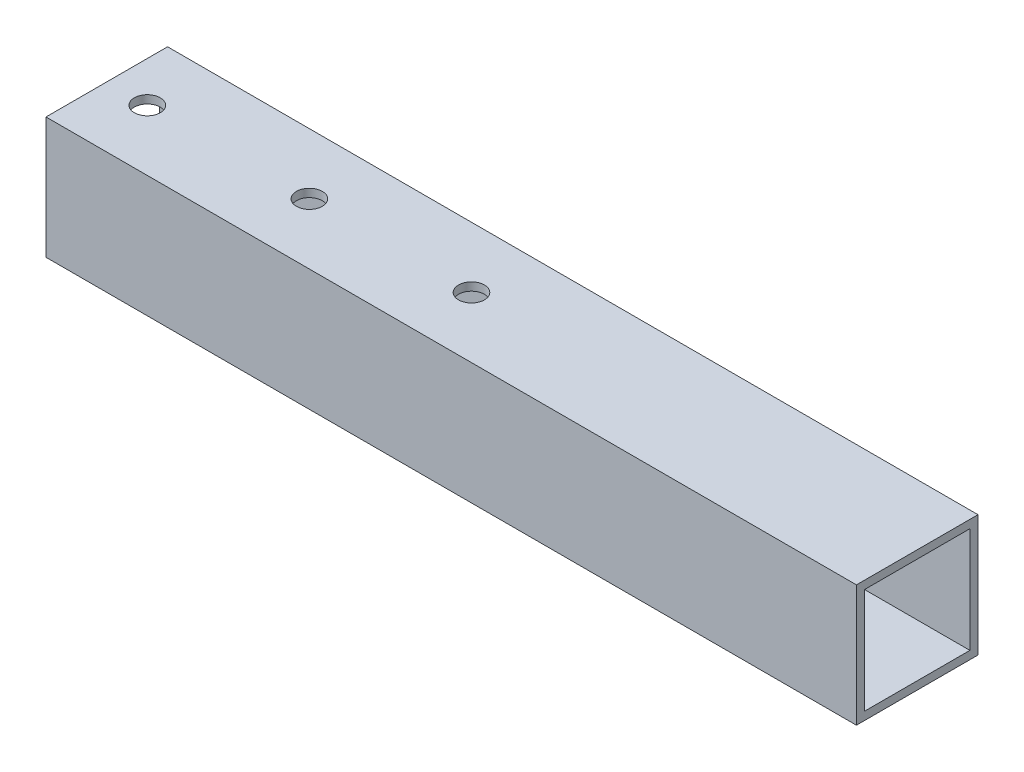
ISO-10303-21;
HEADER;
FILE_DESCRIPTION(('STEP AP214'),'2;1');
FILE_NAME('part.step','',(''),(''),'','','');
FILE_SCHEMA(('AUTOMOTIVE_DESIGN { 1 0 10303 214 1 1 1 1 }'));
ENDSEC;
DATA;
#1=APPLICATION_CONTEXT('core data for automotive mechanical design processes');
#2=APPLICATION_PROTOCOL_DEFINITION('international standard','automotive_design',2000,#1);
#3=PRODUCT_CONTEXT('',#1,'mechanical');
#4=PRODUCT('Part','Part','',(#3));
#5=PRODUCT_RELATED_PRODUCT_CATEGORY('part','',(#4));
#6=PRODUCT_DEFINITION_FORMATION('','',#4);
#7=PRODUCT_DEFINITION_CONTEXT('part definition',#1,'design');
#8=PRODUCT_DEFINITION('design','',#6,#7);
#9=PRODUCT_DEFINITION_SHAPE('','',#8);
#10=(LENGTH_UNIT() NAMED_UNIT(*) SI_UNIT(.MILLI.,.METRE.));
#11=(NAMED_UNIT(*) PLANE_ANGLE_UNIT() SI_UNIT($,.RADIAN.));
#12=(NAMED_UNIT(*) SI_UNIT($,.STERADIAN.) SOLID_ANGLE_UNIT());
#13=UNCERTAINTY_MEASURE_WITH_UNIT(LENGTH_MEASURE(1.E-05),#10,'distance_accuracy_value','');
#14=(GEOMETRIC_REPRESENTATION_CONTEXT(3) GLOBAL_UNCERTAINTY_ASSIGNED_CONTEXT((#13)) GLOBAL_UNIT_ASSIGNED_CONTEXT((#10,
#11,#12)) REPRESENTATION_CONTEXT('',''));
#15=CARTESIAN_POINT('',(0.,0.,0.));
#16=DIRECTION('',(0.,0.,1.));
#17=DIRECTION('',(1.,0.,0.));
#18=AXIS2_PLACEMENT_3D('',#15,#16,#17);
#19=CARTESIAN_POINT('',(100.,-6.50000000000001,-6.49999999999999));
#20=DIRECTION('',(0.,0.,1.));
#21=DIRECTION('',(1.,0.,0.));
#22=AXIS2_PLACEMENT_3D('',#19,#20,#21);
#23=PLANE('',#22);
#24=DIRECTION('',(0.,1.,0.));
#25=VECTOR('',#24,1.);
#26=CARTESIAN_POINT('',(0.,-6.50000000000001,-6.49999999999999));
#27=LINE('',#26,#25);
#28=CARTESIAN_POINT('',(0.,-6.50000000000001,-6.49999999999999));
#29=VERTEX_POINT('',#28);
#30=CARTESIAN_POINT('',(0.,6.49999999999999,-6.49999999999999));
#31=VERTEX_POINT('',#30);
#32=EDGE_CURVE('E164',#29,#31,#27,.T.);
#33=ORIENTED_EDGE('',*,*,#32,.F.);
#34=DIRECTION('',(-1.,0.,0.));
#35=VECTOR('',#34,1.);
#36=CARTESIAN_POINT('',(100.,-6.50000000000001,-6.49999999999999));
#37=LINE('',#36,#35);
#38=CARTESIAN_POINT('',(100.,-6.50000000000001,-6.49999999999999));
#39=VERTEX_POINT('',#38);
#40=EDGE_CURVE('E12',#39,#29,#37,.T.);
#41=ORIENTED_EDGE('',*,*,#40,.F.);
#42=DIRECTION('',(0.,1.,0.));
#43=VECTOR('',#42,1.);
#44=CARTESIAN_POINT('',(100.,-6.50000000000001,-6.49999999999999));
#45=LINE('',#44,#43);
#46=CARTESIAN_POINT('',(100.,6.49999999999999,-6.49999999999999));
#47=VERTEX_POINT('',#46);
#48=EDGE_CURVE('E145',#39,#47,#45,.T.);
#49=ORIENTED_EDGE('',*,*,#48,.T.);
#50=DIRECTION('',(-1.,0.,0.));
#51=VECTOR('',#50,1.);
#52=CARTESIAN_POINT('',(100.,6.49999999999999,-6.49999999999999));
#53=LINE('',#52,#51);
#54=EDGE_CURVE('E76',#47,#31,#53,.T.);
#55=ORIENTED_EDGE('',*,*,#54,.T.);
#56=EDGE_LOOP('',(#33,#41,#49,#55));
#57=FACE_BOUND('',#56,.T.);
#58=ADVANCED_FACE('F57',(#57),#23,.T.);
#59=CARTESIAN_POINT('',(100.,-6.50000000000001,6.50000000000001));
#60=DIRECTION('',(0.,1.,0.));
#61=DIRECTION('',(0.,0.,1.));
#62=AXIS2_PLACEMENT_3D('',#59,#60,#61);
#63=PLANE('',#62);
#64=CARTESIAN_POINT('',(45.,-6.50000000000001,0.));
#65=DIRECTION('',(0.,1.,0.));
#66=DIRECTION('',(0.,0.,1.));
#67=AXIS2_PLACEMENT_3D('',#64,#65,#66);
#68=CIRCLE('',#67,1.60000000000001);
#69=CARTESIAN_POINT('',(45.,-6.50000000000001,1.60000000000001));
#70=VERTEX_POINT('',#69);
#71=EDGE_CURVE('E158',#70,#70,#68,.T.);
#72=ORIENTED_EDGE('',*,*,#71,.F.);
#73=EDGE_LOOP('',(#72));
#74=FACE_BOUND('',#73,.T.);
#75=CARTESIAN_POINT('',(25.,-6.50000000000001,0.));
#76=DIRECTION('',(0.,1.,0.));
#77=DIRECTION('',(0.,0.,1.));
#78=AXIS2_PLACEMENT_3D('',#75,#76,#77);
#79=CIRCLE('',#78,1.60000000000001);
#80=CARTESIAN_POINT('',(25.,-6.50000000000001,1.60000000000001));
#81=VERTEX_POINT('',#80);
#82=EDGE_CURVE('E191',#81,#81,#79,.T.);
#83=ORIENTED_EDGE('',*,*,#82,.F.);
#84=EDGE_LOOP('',(#83));
#85=FACE_BOUND('',#84,.T.);
#86=CARTESIAN_POINT('',(5.,-6.50000000000001,0.));
#87=DIRECTION('',(0.,1.,0.));
#88=DIRECTION('',(0.,0.,1.));
#89=AXIS2_PLACEMENT_3D('',#86,#87,#88);
#90=CIRCLE('',#89,1.6);
#91=CARTESIAN_POINT('',(5.,-6.50000000000001,1.6));
#92=VERTEX_POINT('',#91);
#93=EDGE_CURVE('E187',#92,#92,#90,.T.);
#94=ORIENTED_EDGE('',*,*,#93,.F.);
#95=EDGE_LOOP('',(#94));
#96=FACE_BOUND('',#95,.T.);
#97=DIRECTION('',(0.,0.,-1.));
#98=VECTOR('',#97,1.);
#99=CARTESIAN_POINT('',(0.,-6.50000000000001,6.50000000000001));
#100=LINE('',#99,#98);
#101=CARTESIAN_POINT('',(0.,-6.50000000000001,6.50000000000001));
#102=VERTEX_POINT('',#101);
#103=EDGE_CURVE('E134',#102,#29,#100,.T.);
#104=ORIENTED_EDGE('',*,*,#103,.F.);
#105=DIRECTION('',(-1.,0.,0.));
#106=VECTOR('',#105,1.);
#107=CARTESIAN_POINT('',(100.,-6.50000000000001,6.50000000000001));
#108=LINE('',#107,#106);
#109=CARTESIAN_POINT('',(100.,-6.50000000000001,6.50000000000001));
#110=VERTEX_POINT('',#109);
#111=EDGE_CURVE('E67',#110,#102,#108,.T.);
#112=ORIENTED_EDGE('',*,*,#111,.F.);
#113=DIRECTION('',(0.,0.,-1.));
#114=VECTOR('',#113,1.);
#115=CARTESIAN_POINT('',(100.,-6.50000000000001,6.50000000000001));
#116=LINE('',#115,#114);
#117=EDGE_CURVE('E132',#110,#39,#116,.T.);
#118=ORIENTED_EDGE('',*,*,#117,.T.);
#119=ORIENTED_EDGE('',*,*,#40,.T.);
#120=EDGE_LOOP('',(#104,#112,#118,#119));
#121=FACE_BOUND('',#120,.T.);
#122=ADVANCED_FACE('F131',(#74,#85,#96,#121),#63,.T.);
#123=CARTESIAN_POINT('',(100.,-6.50000000000001,6.50000000000001));
#124=DIRECTION('',(0.,0.,-1.));
#125=DIRECTION('',(-1.,0.,0.));
#126=AXIS2_PLACEMENT_3D('',#123,#124,#125);
#127=PLANE('',#126);
#128=DIRECTION('',(0.,-1.,0.));
#129=VECTOR('',#128,1.);
#130=CARTESIAN_POINT('',(0.,-6.50000000000001,6.50000000000001));
#131=LINE('',#130,#129);
#132=CARTESIAN_POINT('',(0.,6.49999999999999,6.50000000000001));
#133=VERTEX_POINT('',#132);
#134=EDGE_CURVE('E167',#133,#102,#131,.T.);
#135=ORIENTED_EDGE('',*,*,#134,.F.);
#136=DIRECTION('',(-1.,0.,0.));
#137=VECTOR('',#136,1.);
#138=CARTESIAN_POINT('',(100.,6.49999999999999,6.50000000000001));
#139=LINE('',#138,#137);
#140=CARTESIAN_POINT('',(100.,6.49999999999999,6.50000000000001));
#141=VERTEX_POINT('',#140);
#142=EDGE_CURVE('E101',#141,#133,#139,.T.);
#143=ORIENTED_EDGE('',*,*,#142,.F.);
#144=DIRECTION('',(0.,-1.,0.));
#145=VECTOR('',#144,1.);
#146=CARTESIAN_POINT('',(100.,-6.50000000000001,6.50000000000001));
#147=LINE('',#146,#145);
#148=EDGE_CURVE('E144',#141,#110,#147,.T.);
#149=ORIENTED_EDGE('',*,*,#148,.T.);
#150=ORIENTED_EDGE('',*,*,#111,.T.);
#151=EDGE_LOOP('',(#135,#143,#149,#150));
#152=FACE_BOUND('',#151,.T.);
#153=ADVANCED_FACE('F147',(#152),#127,.T.);
#154=CARTESIAN_POINT('',(100.,-7.50000000000001,-7.49999999999999));
#155=DIRECTION('',(0.,0.,1.));
#156=DIRECTION('',(1.,0.,0.));
#157=AXIS2_PLACEMENT_3D('',#154,#155,#156);
#158=PLANE('',#157);
#159=DIRECTION('',(0.,1.,0.));
#160=VECTOR('',#159,1.);
#161=CARTESIAN_POINT('',(0.,-7.50000000000001,-7.49999999999999));
#162=LINE('',#161,#160);
#163=CARTESIAN_POINT('',(0.,-7.50000000000001,-7.49999999999999));
#164=VERTEX_POINT('',#163);
#165=CARTESIAN_POINT('',(0.,7.49999999999999,-7.49999999999999));
#166=VERTEX_POINT('',#165);
#167=EDGE_CURVE('E154',#164,#166,#162,.T.);
#168=ORIENTED_EDGE('',*,*,#167,.T.);
#169=DIRECTION('',(-1.,0.,0.));
#170=VECTOR('',#169,1.);
#171=CARTESIAN_POINT('',(100.,7.49999999999999,-7.49999999999999));
#172=LINE('',#171,#170);
#173=CARTESIAN_POINT('',(100.,7.49999999999999,-7.49999999999999));
#174=VERTEX_POINT('',#173);
#175=EDGE_CURVE('E174',#174,#166,#172,.T.);
#176=ORIENTED_EDGE('',*,*,#175,.F.);
#177=DIRECTION('',(0.,1.,0.));
#178=VECTOR('',#177,1.);
#179=CARTESIAN_POINT('',(100.,-7.50000000000001,-7.49999999999999));
#180=LINE('',#179,#178);
#181=CARTESIAN_POINT('',(100.,-7.50000000000001,-7.49999999999999));
#182=VERTEX_POINT('',#181);
#183=EDGE_CURVE('E172',#182,#174,#180,.T.);
#184=ORIENTED_EDGE('',*,*,#183,.F.);
#185=DIRECTION('',(-1.,0.,0.));
#186=VECTOR('',#185,1.);
#187=CARTESIAN_POINT('',(100.,-7.50000000000001,-7.49999999999999));
#188=LINE('',#187,#186);
#189=EDGE_CURVE('E150',#182,#164,#188,.T.);
#190=ORIENTED_EDGE('',*,*,#189,.T.);
#191=EDGE_LOOP('',(#168,#176,#184,#190));
#192=FACE_BOUND('',#191,.T.);
#193=ADVANCED_FACE('F59',(#192),#158,.F.);
#194=CARTESIAN_POINT('',(100.,7.49999999999999,7.50000000000001));
#195=DIRECTION('',(0.,-1.,0.));
#196=DIRECTION('',(0.,0.,-1.));
#197=AXIS2_PLACEMENT_3D('',#194,#195,#196);
#198=PLANE('',#197);
#199=CARTESIAN_POINT('',(45.,7.49999999999999,0.));
#200=DIRECTION('',(0.,1.,0.));
#201=DIRECTION('',(0.,0.,1.));
#202=AXIS2_PLACEMENT_3D('',#199,#200,#201);
#203=CIRCLE('',#202,1.60000000000001);
#204=CARTESIAN_POINT('',(45.,7.49999999999999,1.60000000000001));
#205=VERTEX_POINT('',#204);
#206=EDGE_CURVE('E252',#205,#205,#203,.T.);
#207=ORIENTED_EDGE('',*,*,#206,.F.);
#208=EDGE_LOOP('',(#207));
#209=FACE_BOUND('',#208,.T.);
#210=CARTESIAN_POINT('',(25.,7.49999999999999,0.));
#211=DIRECTION('',(0.,1.,0.));
#212=DIRECTION('',(0.,0.,1.));
#213=AXIS2_PLACEMENT_3D('',#210,#211,#212);
#214=CIRCLE('',#213,1.60000000000001);
#215=CARTESIAN_POINT('',(25.,7.49999999999999,1.60000000000001));
#216=VERTEX_POINT('',#215);
#217=EDGE_CURVE('E256',#216,#216,#214,.T.);
#218=ORIENTED_EDGE('',*,*,#217,.F.);
#219=EDGE_LOOP('',(#218));
#220=FACE_BOUND('',#219,.T.);
#221=CARTESIAN_POINT('',(5.,7.49999999999999,0.));
#222=DIRECTION('',(0.,1.,0.));
#223=DIRECTION('',(0.,0.,1.));
#224=AXIS2_PLACEMENT_3D('',#221,#222,#223);
#225=CIRCLE('',#224,1.6);
#226=CARTESIAN_POINT('',(5.,7.49999999999999,1.6));
#227=VERTEX_POINT('',#226);
#228=EDGE_CURVE('E259',#227,#227,#225,.T.);
#229=ORIENTED_EDGE('',*,*,#228,.F.);
#230=EDGE_LOOP('',(#229));
#231=FACE_BOUND('',#230,.T.);
#232=DIRECTION('',(0.,0.,1.));
#233=VECTOR('',#232,1.);
#234=CARTESIAN_POINT('',(0.,7.49999999999999,7.50000000000001));
#235=LINE('',#234,#233);
#236=CARTESIAN_POINT('',(0.,7.49999999999999,7.50000000000001));
#237=VERTEX_POINT('',#236);
#238=EDGE_CURVE('E157',#166,#237,#235,.T.);
#239=ORIENTED_EDGE('',*,*,#238,.T.);
#240=DIRECTION('',(-1.,0.,0.));
#241=VECTOR('',#240,1.);
#242=CARTESIAN_POINT('',(100.,7.49999999999999,7.50000000000001));
#243=LINE('',#242,#241);
#244=CARTESIAN_POINT('',(100.,7.49999999999999,7.50000000000001));
#245=VERTEX_POINT('',#244);
#246=EDGE_CURVE('E181',#245,#237,#243,.T.);
#247=ORIENTED_EDGE('',*,*,#246,.F.);
#248=DIRECTION('',(0.,0.,1.));
#249=VECTOR('',#248,1.);
#250=CARTESIAN_POINT('',(100.,7.49999999999999,7.50000000000001));
#251=LINE('',#250,#249);
#252=EDGE_CURVE('E114',#174,#245,#251,.T.);
#253=ORIENTED_EDGE('',*,*,#252,.F.);
#254=ORIENTED_EDGE('',*,*,#175,.T.);
#255=EDGE_LOOP('',(#239,#247,#253,#254));
#256=FACE_BOUND('',#255,.T.);
#257=ADVANCED_FACE('F241',(#209,#220,#231,#256),#198,.F.);
#258=CARTESIAN_POINT('',(100.,-7.50000000000001,7.49999999999999));
#259=DIRECTION('',(0.,0.,-1.));
#260=DIRECTION('',(0.,1.,0.));
#261=AXIS2_PLACEMENT_3D('',#258,#259,#260);
#262=PLANE('',#261);
#263=DIRECTION('',(0.,-1.,0.));
#264=VECTOR('',#263,1.);
#265=CARTESIAN_POINT('',(0.,-7.50000000000001,7.49999999999999));
#266=LINE('',#265,#264);
#267=CARTESIAN_POINT('',(0.,-7.50000000000001,7.49999999999999));
#268=VERTEX_POINT('',#267);
#269=EDGE_CURVE('E160',#237,#268,#266,.T.);
#270=ORIENTED_EDGE('',*,*,#269,.T.);
#271=DIRECTION('',(-1.,0.,0.));
#272=VECTOR('',#271,1.);
#273=CARTESIAN_POINT('',(100.,-7.50000000000001,7.49999999999999));
#274=LINE('',#273,#272);
#275=CARTESIAN_POINT('',(100.,-7.50000000000001,7.49999999999999));
#276=VERTEX_POINT('',#275);
#277=EDGE_CURVE('E178',#276,#268,#274,.T.);
#278=ORIENTED_EDGE('',*,*,#277,.F.);
#279=DIRECTION('',(0.,-1.,0.));
#280=VECTOR('',#279,1.);
#281=CARTESIAN_POINT('',(100.,-7.50000000000001,7.49999999999999));
#282=LINE('',#281,#280);
#283=EDGE_CURVE('E208',#245,#276,#282,.T.);
#284=ORIENTED_EDGE('',*,*,#283,.F.);
#285=ORIENTED_EDGE('',*,*,#246,.T.);
#286=EDGE_LOOP('',(#270,#278,#284,#285));
#287=FACE_BOUND('',#286,.T.);
#288=ADVANCED_FACE('F224',(#287),#262,.F.);
#289=CARTESIAN_POINT('',(100.,-7.50000000000001,7.49999999999999));
#290=DIRECTION('',(0.,1.,0.));
#291=DIRECTION('',(0.,0.,1.));
#292=AXIS2_PLACEMENT_3D('',#289,#290,#291);
#293=PLANE('',#292);
#294=CARTESIAN_POINT('',(45.,-7.50000000000001,0.));
#295=DIRECTION('',(0.,1.,0.));
#296=DIRECTION('',(0.,0.,1.));
#297=AXIS2_PLACEMENT_3D('',#294,#295,#296);
#298=CIRCLE('',#297,1.60000000000001);
#299=CARTESIAN_POINT('',(45.,-7.50000000000001,1.60000000000001));
#300=VERTEX_POINT('',#299);
#301=EDGE_CURVE('E188',#300,#300,#298,.T.);
#302=ORIENTED_EDGE('',*,*,#301,.T.);
#303=EDGE_LOOP('',(#302));
#304=FACE_BOUND('',#303,.T.);
#305=CARTESIAN_POINT('',(25.,-7.50000000000001,0.));
#306=DIRECTION('',(0.,1.,0.));
#307=DIRECTION('',(0.,0.,1.));
#308=AXIS2_PLACEMENT_3D('',#305,#306,#307);
#309=CIRCLE('',#308,1.60000000000001);
#310=CARTESIAN_POINT('',(25.,-7.50000000000001,1.60000000000001));
#311=VERTEX_POINT('',#310);
#312=EDGE_CURVE('E307',#311,#311,#309,.T.);
#313=ORIENTED_EDGE('',*,*,#312,.T.);
#314=EDGE_LOOP('',(#313));
#315=FACE_BOUND('',#314,.T.);
#316=CARTESIAN_POINT('',(5.,-7.50000000000001,0.));
#317=DIRECTION('',(0.,1.,0.));
#318=DIRECTION('',(0.,0.,1.));
#319=AXIS2_PLACEMENT_3D('',#316,#317,#318);
#320=CIRCLE('',#319,1.6);
#321=CARTESIAN_POINT('',(5.,-7.50000000000001,1.6));
#322=VERTEX_POINT('',#321);
#323=EDGE_CURVE('E201',#322,#322,#320,.T.);
#324=ORIENTED_EDGE('',*,*,#323,.T.);
#325=EDGE_LOOP('',(#324));
#326=FACE_BOUND('',#325,.T.);
#327=DIRECTION('',(0.,0.,-1.));
#328=VECTOR('',#327,1.);
#329=CARTESIAN_POINT('',(0.,-7.50000000000001,7.49999999999999));
#330=LINE('',#329,#328);
#331=EDGE_CURVE('E162',#268,#164,#330,.T.);
#332=ORIENTED_EDGE('',*,*,#331,.T.);
#333=ORIENTED_EDGE('',*,*,#189,.F.);
#334=DIRECTION('',(0.,0.,-1.));
#335=VECTOR('',#334,1.);
#336=CARTESIAN_POINT('',(100.,-7.50000000000001,7.49999999999999));
#337=LINE('',#336,#335);
#338=EDGE_CURVE('E210',#276,#182,#337,.T.);
#339=ORIENTED_EDGE('',*,*,#338,.F.);
#340=ORIENTED_EDGE('',*,*,#277,.T.);
#341=EDGE_LOOP('',(#332,#333,#339,#340));
#342=FACE_BOUND('',#341,.T.);
#343=ADVANCED_FACE('F213',(#304,#315,#326,#342),#293,.F.);
#344=CARTESIAN_POINT('',(100.,6.49999999999999,6.50000000000001));
#345=DIRECTION('',(0.,-1.,0.));
#346=DIRECTION('',(0.,0.,-1.));
#347=AXIS2_PLACEMENT_3D('',#344,#345,#346);
#348=PLANE('',#347);
#349=CARTESIAN_POINT('',(45.,6.49999999999999,0.));
#350=DIRECTION('',(0.,-1.,0.));
#351=DIRECTION('',(0.,0.,-1.));
#352=AXIS2_PLACEMENT_3D('',#349,#350,#351);
#353=CIRCLE('',#352,1.60000000000001);
#354=CARTESIAN_POINT('',(45.,6.49999999999999,-1.60000000000001));
#355=VERTEX_POINT('',#354);
#356=EDGE_CURVE('E61',#355,#355,#353,.T.);
#357=ORIENTED_EDGE('',*,*,#356,.F.);
#358=EDGE_LOOP('',(#357));
#359=FACE_BOUND('',#358,.T.);
#360=CARTESIAN_POINT('',(25.,6.49999999999999,0.));
#361=DIRECTION('',(0.,-1.,0.));
#362=DIRECTION('',(0.,0.,-1.));
#363=AXIS2_PLACEMENT_3D('',#360,#361,#362);
#364=CIRCLE('',#363,1.60000000000001);
#365=CARTESIAN_POINT('',(25.,6.49999999999999,-1.60000000000001));
#366=VERTEX_POINT('',#365);
#367=EDGE_CURVE('E189',#366,#366,#364,.T.);
#368=ORIENTED_EDGE('',*,*,#367,.F.);
#369=EDGE_LOOP('',(#368));
#370=FACE_BOUND('',#369,.T.);
#371=CARTESIAN_POINT('',(5.,6.49999999999999,0.));
#372=DIRECTION('',(0.,-1.,0.));
#373=DIRECTION('',(0.,0.,-1.));
#374=AXIS2_PLACEMENT_3D('',#371,#372,#373);
#375=CIRCLE('',#374,1.6);
#376=CARTESIAN_POINT('',(5.,6.49999999999999,-1.6));
#377=VERTEX_POINT('',#376);
#378=EDGE_CURVE('E185',#377,#377,#375,.T.);
#379=ORIENTED_EDGE('',*,*,#378,.F.);
#380=EDGE_LOOP('',(#379));
#381=FACE_BOUND('',#380,.T.);
#382=DIRECTION('',(0.,0.,1.));
#383=VECTOR('',#382,1.);
#384=CARTESIAN_POINT('',(0.,6.49999999999999,6.50000000000001));
#385=LINE('',#384,#383);
#386=EDGE_CURVE('E169',#31,#133,#385,.T.);
#387=ORIENTED_EDGE('',*,*,#386,.F.);
#388=ORIENTED_EDGE('',*,*,#54,.F.);
#389=DIRECTION('',(0.,0.,1.));
#390=VECTOR('',#389,1.);
#391=CARTESIAN_POINT('',(100.,6.49999999999999,6.50000000000001));
#392=LINE('',#391,#390);
#393=EDGE_CURVE('E148',#47,#141,#392,.T.);
#394=ORIENTED_EDGE('',*,*,#393,.T.);
#395=ORIENTED_EDGE('',*,*,#142,.T.);
#396=EDGE_LOOP('',(#387,#388,#394,#395));
#397=FACE_BOUND('',#396,.T.);
#398=ADVANCED_FACE('F211',(#359,#370,#381,#397),#348,.T.);
#399=CARTESIAN_POINT('',(100.,0.,0.));
#400=DIRECTION('',(-1.,0.,0.));
#401=DIRECTION('',(0.,0.,1.));
#402=AXIS2_PLACEMENT_3D('',#399,#400,#401);
#403=PLANE('',#402);
#404=ORIENTED_EDGE('',*,*,#183,.T.);
#405=ORIENTED_EDGE('',*,*,#252,.T.);
#406=ORIENTED_EDGE('',*,*,#283,.T.);
#407=ORIENTED_EDGE('',*,*,#338,.T.);
#408=EDGE_LOOP('',(#404,#405,#406,#407));
#409=FACE_BOUND('',#408,.T.);
#410=ORIENTED_EDGE('',*,*,#48,.F.);
#411=ORIENTED_EDGE('',*,*,#117,.F.);
#412=ORIENTED_EDGE('',*,*,#148,.F.);
#413=ORIENTED_EDGE('',*,*,#393,.F.);
#414=EDGE_LOOP('',(#410,#411,#412,#413));
#415=FACE_BOUND('',#414,.T.);
#416=ADVANCED_FACE('F142',(#409,#415),#403,.F.);
#417=CARTESIAN_POINT('',(0.,0.,0.));
#418=DIRECTION('',(-1.,0.,0.));
#419=DIRECTION('',(0.,0.,1.));
#420=AXIS2_PLACEMENT_3D('',#417,#418,#419);
#421=PLANE('',#420);
#422=ORIENTED_EDGE('',*,*,#167,.F.);
#423=ORIENTED_EDGE('',*,*,#331,.F.);
#424=ORIENTED_EDGE('',*,*,#269,.F.);
#425=ORIENTED_EDGE('',*,*,#238,.F.);
#426=EDGE_LOOP('',(#422,#423,#424,#425));
#427=FACE_BOUND('',#426,.T.);
#428=ORIENTED_EDGE('',*,*,#32,.T.);
#429=ORIENTED_EDGE('',*,*,#386,.T.);
#430=ORIENTED_EDGE('',*,*,#134,.T.);
#431=ORIENTED_EDGE('',*,*,#103,.T.);
#432=EDGE_LOOP('',(#428,#429,#430,#431));
#433=FACE_BOUND('',#432,.T.);
#434=ADVANCED_FACE('F221',(#427,#433),#421,.T.);
#435=CARTESIAN_POINT('',(5.,-7.50000000000001,0.));
#436=DIRECTION('',(0.,1.,0.));
#437=DIRECTION('',(0.,0.,1.));
#438=AXIS2_PLACEMENT_3D('',#435,#436,#437);
#439=CYLINDRICAL_SURFACE('',#438,1.6);
#440=ORIENTED_EDGE('',*,*,#378,.T.);
#441=EDGE_LOOP('',(#440));
#442=FACE_BOUND('',#441,.T.);
#443=ORIENTED_EDGE('',*,*,#228,.T.);
#444=EDGE_LOOP('',(#443));
#445=FACE_BOUND('',#444,.T.);
#446=ADVANCED_FACE('F273',(#442,#445),#439,.F.);
#447=CARTESIAN_POINT('',(25.,-7.50000000000001,0.));
#448=DIRECTION('',(0.,1.,0.));
#449=DIRECTION('',(0.,0.,1.));
#450=AXIS2_PLACEMENT_3D('',#447,#448,#449);
#451=CYLINDRICAL_SURFACE('',#450,1.60000000000001);
#452=ORIENTED_EDGE('',*,*,#367,.T.);
#453=EDGE_LOOP('',(#452));
#454=FACE_BOUND('',#453,.T.);
#455=ORIENTED_EDGE('',*,*,#217,.T.);
#456=EDGE_LOOP('',(#455));
#457=FACE_BOUND('',#456,.T.);
#458=ADVANCED_FACE('F276',(#454,#457),#451,.F.);
#459=CARTESIAN_POINT('',(45.,-7.50000000000001,0.));
#460=DIRECTION('',(0.,1.,0.));
#461=DIRECTION('',(0.,0.,1.));
#462=AXIS2_PLACEMENT_3D('',#459,#460,#461);
#463=CYLINDRICAL_SURFACE('',#462,1.60000000000001);
#464=ORIENTED_EDGE('',*,*,#356,.T.);
#465=EDGE_LOOP('',(#464));
#466=FACE_BOUND('',#465,.T.);
#467=ORIENTED_EDGE('',*,*,#206,.T.);
#468=EDGE_LOOP('',(#467));
#469=FACE_BOUND('',#468,.T.);
#470=ADVANCED_FACE('F283',(#466,#469),#463,.F.);
#471=ORIENTED_EDGE('',*,*,#93,.T.);
#472=EDGE_LOOP('',(#471));
#473=FACE_BOUND('',#472,.T.);
#474=ORIENTED_EDGE('',*,*,#323,.F.);
#475=EDGE_LOOP('',(#474));
#476=FACE_BOUND('',#475,.T.);
#477=ADVANCED_FACE('F279',(#473,#476),#439,.F.);
#478=ORIENTED_EDGE('',*,*,#82,.T.);
#479=EDGE_LOOP('',(#478));
#480=FACE_BOUND('',#479,.T.);
#481=ORIENTED_EDGE('',*,*,#312,.F.);
#482=EDGE_LOOP('',(#481));
#483=FACE_BOUND('',#482,.T.);
#484=ADVANCED_FACE('F284',(#480,#483),#451,.F.);
#485=ORIENTED_EDGE('',*,*,#71,.T.);
#486=EDGE_LOOP('',(#485));
#487=FACE_BOUND('',#486,.T.);
#488=ORIENTED_EDGE('',*,*,#301,.F.);
#489=EDGE_LOOP('',(#488));
#490=FACE_BOUND('',#489,.T.);
#491=ADVANCED_FACE('F287',(#487,#490),#463,.F.);
#492=CLOSED_SHELL('',(#58,#122,#153,#193,#257,#288,#343,#398,#416,#434,#446,#458,#470,#477,#484,#491));
#493=MANIFOLD_SOLID_BREP('B2',#492);
#494=ADVANCED_BREP_SHAPE_REPRESENTATION('',(#18,#493),#14);
#495=SHAPE_DEFINITION_REPRESENTATION(#9,#494);
ENDSEC;
END-ISO-10303-21;
